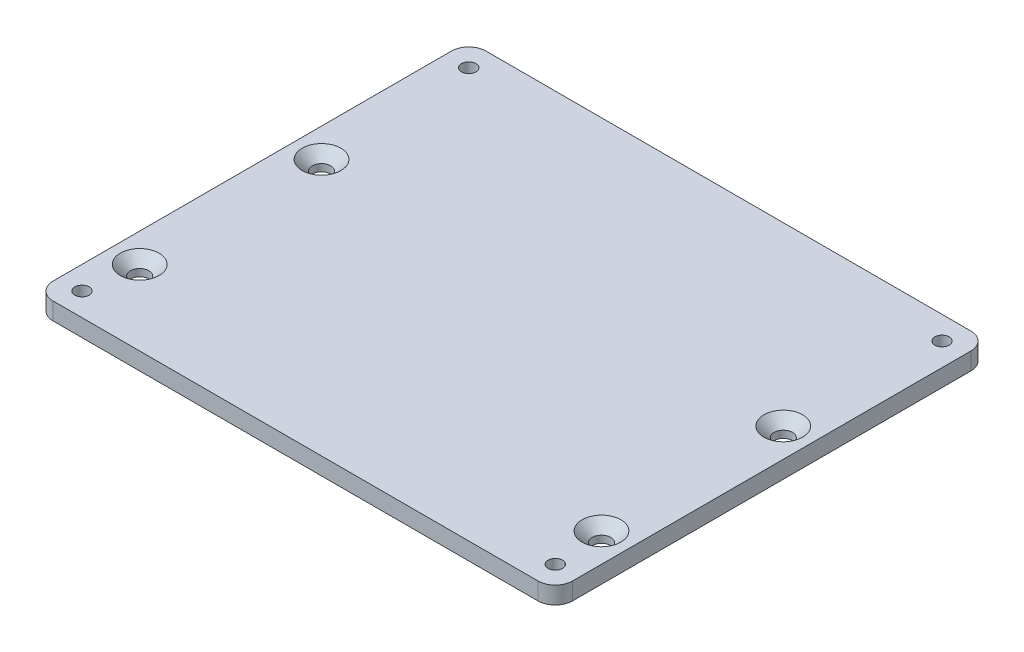
ISO-10303-21;
HEADER;
FILE_DESCRIPTION(('STEP AP214'),'2;1');
FILE_NAME('part.step','',(''),(''),'','','');
FILE_SCHEMA(('AUTOMOTIVE_DESIGN { 1 0 10303 214 1 1 1 1 }'));
ENDSEC;
DATA;
#1=APPLICATION_CONTEXT('core data for automotive mechanical design processes');
#2=APPLICATION_PROTOCOL_DEFINITION('international standard','automotive_design',2000,#1);
#3=PRODUCT_CONTEXT('',#1,'mechanical');
#4=PRODUCT('Part','Part','',(#3));
#5=PRODUCT_RELATED_PRODUCT_CATEGORY('part','',(#4));
#6=PRODUCT_DEFINITION_FORMATION('','',#4);
#7=PRODUCT_DEFINITION_CONTEXT('part definition',#1,'design');
#8=PRODUCT_DEFINITION('design','',#6,#7);
#9=PRODUCT_DEFINITION_SHAPE('','',#8);
#10=(LENGTH_UNIT() NAMED_UNIT(*) SI_UNIT(.MILLI.,.METRE.));
#11=(NAMED_UNIT(*) PLANE_ANGLE_UNIT() SI_UNIT($,.RADIAN.));
#12=(NAMED_UNIT(*) SI_UNIT($,.STERADIAN.) SOLID_ANGLE_UNIT());
#13=UNCERTAINTY_MEASURE_WITH_UNIT(LENGTH_MEASURE(1.E-05),#10,'distance_accuracy_value','');
#14=(GEOMETRIC_REPRESENTATION_CONTEXT(3) GLOBAL_UNCERTAINTY_ASSIGNED_CONTEXT((#13)) GLOBAL_UNIT_ASSIGNED_CONTEXT((#10,
#11,#12)) REPRESENTATION_CONTEXT('',''));
#15=CARTESIAN_POINT('',(0.,0.,0.));
#16=DIRECTION('',(0.,0.,1.));
#17=DIRECTION('',(1.,0.,0.));
#18=AXIS2_PLACEMENT_3D('',#15,#16,#17);
#19=CARTESIAN_POINT('',(-45.,3.,37.5));
#20=DIRECTION('',(1.,0.,0.));
#21=DIRECTION('',(0.,0.,-1.));
#22=AXIS2_PLACEMENT_3D('',#19,#20,#21);
#23=PLANE('',#22);
#24=DIRECTION('',(0.,0.,1.));
#25=VECTOR('',#24,1.);
#26=CARTESIAN_POINT('',(-45.,0.,37.5));
#27=LINE('',#26,#25);
#28=CARTESIAN_POINT('',(-45.,0.,-34.5));
#29=VERTEX_POINT('',#28);
#30=CARTESIAN_POINT('',(-45.,0.,34.5));
#31=VERTEX_POINT('',#30);
#32=EDGE_CURVE('E160',#29,#31,#27,.T.);
#33=ORIENTED_EDGE('',*,*,#32,.T.);
#34=DIRECTION('',(0.,-1.,0.));
#35=VECTOR('',#34,1.);
#36=CARTESIAN_POINT('',(-45.,3.,34.5));
#37=LINE('',#36,#35);
#38=CARTESIAN_POINT('',(-45.,3.,34.5));
#39=VERTEX_POINT('',#38);
#40=EDGE_CURVE('E11',#31,#39,#37,.F.);
#41=ORIENTED_EDGE('',*,*,#40,.T.);
#42=DIRECTION('',(0.,0.,1.));
#43=VECTOR('',#42,1.);
#44=CARTESIAN_POINT('',(-45.,3.,37.5));
#45=LINE('',#44,#43);
#46=CARTESIAN_POINT('',(-45.,3.,-34.5));
#47=VERTEX_POINT('',#46);
#48=EDGE_CURVE('E128',#47,#39,#45,.T.);
#49=ORIENTED_EDGE('',*,*,#48,.F.);
#50=DIRECTION('',(0.,-1.,0.));
#51=VECTOR('',#50,1.);
#52=CARTESIAN_POINT('',(-45.,3.,-34.5));
#53=LINE('',#52,#51);
#54=EDGE_CURVE('E44',#47,#29,#53,.T.);
#55=ORIENTED_EDGE('',*,*,#54,.T.);
#56=EDGE_LOOP('',(#33,#41,#49,#55));
#57=FACE_BOUND('',#56,.T.);
#58=ADVANCED_FACE('F36',(#57),#23,.F.);
#59=CARTESIAN_POINT('',(45.,3.,37.5));
#60=DIRECTION('',(0.,0.,-1.));
#61=DIRECTION('',(-1.,0.,0.));
#62=AXIS2_PLACEMENT_3D('',#59,#60,#61);
#63=PLANE('',#62);
#64=DIRECTION('',(1.,0.,0.));
#65=VECTOR('',#64,1.);
#66=CARTESIAN_POINT('',(45.,0.,37.5));
#67=LINE('',#66,#65);
#68=CARTESIAN_POINT('',(-42.,0.,37.5));
#69=VERTEX_POINT('',#68);
#70=CARTESIAN_POINT('',(42.,0.,37.5));
#71=VERTEX_POINT('',#70);
#72=EDGE_CURVE('E133',#69,#71,#67,.T.);
#73=ORIENTED_EDGE('',*,*,#72,.T.);
#74=DIRECTION('',(0.,-1.,0.));
#75=VECTOR('',#74,1.);
#76=CARTESIAN_POINT('',(42.,3.,37.5));
#77=LINE('',#76,#75);
#78=CARTESIAN_POINT('',(42.,3.,37.5));
#79=VERTEX_POINT('',#78);
#80=EDGE_CURVE('E51',#71,#79,#77,.F.);
#81=ORIENTED_EDGE('',*,*,#80,.T.);
#82=DIRECTION('',(1.,0.,0.));
#83=VECTOR('',#82,1.);
#84=CARTESIAN_POINT('',(45.,3.,37.5));
#85=LINE('',#84,#83);
#86=CARTESIAN_POINT('',(-42.,3.,37.5));
#87=VERTEX_POINT('',#86);
#88=EDGE_CURVE('E131',#87,#79,#85,.T.);
#89=ORIENTED_EDGE('',*,*,#88,.F.);
#90=DIRECTION('',(0.,-1.,0.));
#91=VECTOR('',#90,1.);
#92=CARTESIAN_POINT('',(-42.,3.,37.5));
#93=LINE('',#92,#91);
#94=EDGE_CURVE('E152',#87,#69,#93,.T.);
#95=ORIENTED_EDGE('',*,*,#94,.T.);
#96=EDGE_LOOP('',(#73,#81,#89,#95));
#97=FACE_BOUND('',#96,.T.);
#98=ADVANCED_FACE('F259',(#97),#63,.F.);
#99=CARTESIAN_POINT('',(45.,3.,37.5));
#100=DIRECTION('',(-1.,0.,0.));
#101=DIRECTION('',(0.,0.,1.));
#102=AXIS2_PLACEMENT_3D('',#99,#100,#101);
#103=PLANE('',#102);
#104=DIRECTION('',(0.,0.,-1.));
#105=VECTOR('',#104,1.);
#106=CARTESIAN_POINT('',(45.,0.,37.5));
#107=LINE('',#106,#105);
#108=CARTESIAN_POINT('',(45.,0.,34.5));
#109=VERTEX_POINT('',#108);
#110=CARTESIAN_POINT('',(45.,0.,-34.5));
#111=VERTEX_POINT('',#110);
#112=EDGE_CURVE('E129',#109,#111,#107,.T.);
#113=ORIENTED_EDGE('',*,*,#112,.T.);
#114=DIRECTION('',(0.,-1.,0.));
#115=VECTOR('',#114,1.);
#116=CARTESIAN_POINT('',(45.,3.,-34.5));
#117=LINE('',#116,#115);
#118=CARTESIAN_POINT('',(45.,3.,-34.5));
#119=VERTEX_POINT('',#118);
#120=EDGE_CURVE('E107',#111,#119,#117,.F.);
#121=ORIENTED_EDGE('',*,*,#120,.T.);
#122=DIRECTION('',(0.,0.,-1.));
#123=VECTOR('',#122,1.);
#124=CARTESIAN_POINT('',(45.,3.,37.5));
#125=LINE('',#124,#123);
#126=CARTESIAN_POINT('',(45.,3.,34.5));
#127=VERTEX_POINT('',#126);
#128=EDGE_CURVE('E172',#127,#119,#125,.T.);
#129=ORIENTED_EDGE('',*,*,#128,.F.);
#130=DIRECTION('',(0.,-1.,0.));
#131=VECTOR('',#130,1.);
#132=CARTESIAN_POINT('',(45.,3.,34.5));
#133=LINE('',#132,#131);
#134=EDGE_CURVE('E112',#127,#109,#133,.T.);
#135=ORIENTED_EDGE('',*,*,#134,.T.);
#136=EDGE_LOOP('',(#113,#121,#129,#135));
#137=FACE_BOUND('',#136,.T.);
#138=ADVANCED_FACE('F256',(#137),#103,.F.);
#139=CARTESIAN_POINT('',(45.,3.,-37.5));
#140=DIRECTION('',(0.,0.,1.));
#141=DIRECTION('',(1.,0.,0.));
#142=AXIS2_PLACEMENT_3D('',#139,#140,#141);
#143=PLANE('',#142);
#144=DIRECTION('',(-1.,0.,0.));
#145=VECTOR('',#144,1.);
#146=CARTESIAN_POINT('',(45.,3.,-37.5));
#147=LINE('',#146,#145);
#148=CARTESIAN_POINT('',(42.,3.,-37.5));
#149=VERTEX_POINT('',#148);
#150=CARTESIAN_POINT('',(-42.,3.,-37.5));
#151=VERTEX_POINT('',#150);
#152=EDGE_CURVE('E122',#149,#151,#147,.T.);
#153=ORIENTED_EDGE('',*,*,#152,.F.);
#154=DIRECTION('',(0.,-1.,0.));
#155=VECTOR('',#154,1.);
#156=CARTESIAN_POINT('',(42.,3.,-37.5));
#157=LINE('',#156,#155);
#158=CARTESIAN_POINT('',(42.,0.,-37.5));
#159=VERTEX_POINT('',#158);
#160=EDGE_CURVE('E106',#149,#159,#157,.T.);
#161=ORIENTED_EDGE('',*,*,#160,.T.);
#162=DIRECTION('',(-1.,0.,0.));
#163=VECTOR('',#162,1.);
#164=CARTESIAN_POINT('',(45.,0.,-37.5));
#165=LINE('',#164,#163);
#166=CARTESIAN_POINT('',(-42.,0.,-37.5));
#167=VERTEX_POINT('',#166);
#168=EDGE_CURVE('E119',#159,#167,#165,.T.);
#169=ORIENTED_EDGE('',*,*,#168,.T.);
#170=DIRECTION('',(0.,-1.,0.));
#171=VECTOR('',#170,1.);
#172=CARTESIAN_POINT('',(-42.,3.,-37.5));
#173=LINE('',#172,#171);
#174=EDGE_CURVE('E124',#167,#151,#173,.F.);
#175=ORIENTED_EDGE('',*,*,#174,.T.);
#176=EDGE_LOOP('',(#153,#161,#169,#175));
#177=FACE_BOUND('',#176,.T.);
#178=ADVANCED_FACE('F118',(#177),#143,.F.);
#179=CARTESIAN_POINT('',(0.,3.,0.));
#180=DIRECTION('',(0.,1.,0.));
#181=DIRECTION('',(0.,0.,1.));
#182=AXIS2_PLACEMENT_3D('',#179,#180,#181);
#183=PLANE('',#182);
#184=CARTESIAN_POINT('',(-40.,3.,-6.99999999999999));
#185=DIRECTION('',(0.,1.,0.));
#186=DIRECTION('',(0.,0.,1.));
#187=AXIS2_PLACEMENT_3D('',#184,#185,#186);
#188=CIRCLE('',#187,3.36);
#189=CARTESIAN_POINT('',(-40.,3.,-3.63999999999999));
#190=VERTEX_POINT('',#189);
#191=EDGE_CURVE('E229',#190,#190,#188,.T.);
#192=ORIENTED_EDGE('',*,*,#191,.F.);
#193=EDGE_LOOP('',(#192));
#194=FACE_BOUND('',#193,.T.);
#195=CARTESIAN_POINT('',(-40.,3.,24.5));
#196=DIRECTION('',(0.,1.,0.));
#197=DIRECTION('',(0.,0.,1.));
#198=AXIS2_PLACEMENT_3D('',#195,#196,#197);
#199=CIRCLE('',#198,3.36);
#200=CARTESIAN_POINT('',(-40.,3.,27.86));
#201=VERTEX_POINT('',#200);
#202=EDGE_CURVE('E220',#201,#201,#199,.T.);
#203=ORIENTED_EDGE('',*,*,#202,.F.);
#204=EDGE_LOOP('',(#203));
#205=FACE_BOUND('',#204,.T.);
#206=CARTESIAN_POINT('',(40.,3.,24.5));
#207=DIRECTION('',(0.,1.,0.));
#208=DIRECTION('',(0.,0.,1.));
#209=AXIS2_PLACEMENT_3D('',#206,#207,#208);
#210=CIRCLE('',#209,3.36);
#211=CARTESIAN_POINT('',(40.,3.,27.86));
#212=VERTEX_POINT('',#211);
#213=EDGE_CURVE('E211',#212,#212,#210,.T.);
#214=ORIENTED_EDGE('',*,*,#213,.F.);
#215=EDGE_LOOP('',(#214));
#216=FACE_BOUND('',#215,.T.);
#217=CARTESIAN_POINT('',(40.,3.,-7.));
#218=DIRECTION('',(0.,1.,0.));
#219=DIRECTION('',(0.,0.,1.));
#220=AXIS2_PLACEMENT_3D('',#217,#218,#219);
#221=CIRCLE('',#220,3.36);
#222=CARTESIAN_POINT('',(40.,3.,-3.64));
#223=VERTEX_POINT('',#222);
#224=EDGE_CURVE('E202',#223,#223,#221,.T.);
#225=ORIENTED_EDGE('',*,*,#224,.F.);
#226=EDGE_LOOP('',(#225));
#227=FACE_BOUND('',#226,.T.);
#228=CARTESIAN_POINT('',(-41.,3.,-33.5));
#229=DIRECTION('',(0.,1.,0.));
#230=DIRECTION('',(0.,0.,1.));
#231=AXIS2_PLACEMENT_3D('',#228,#229,#230);
#232=CIRCLE('',#231,1.25);
#233=CARTESIAN_POINT('',(-41.,3.,-32.25));
#234=VERTEX_POINT('',#233);
#235=EDGE_CURVE('E193',#234,#234,#232,.T.);
#236=ORIENTED_EDGE('',*,*,#235,.F.);
#237=EDGE_LOOP('',(#236));
#238=FACE_BOUND('',#237,.T.);
#239=CARTESIAN_POINT('',(-41.,3.,33.5));
#240=DIRECTION('',(0.,1.,0.));
#241=DIRECTION('',(0.,0.,1.));
#242=AXIS2_PLACEMENT_3D('',#239,#240,#241);
#243=CIRCLE('',#242,1.25);
#244=CARTESIAN_POINT('',(-41.,3.,34.75));
#245=VERTEX_POINT('',#244);
#246=EDGE_CURVE('E187',#245,#245,#243,.T.);
#247=ORIENTED_EDGE('',*,*,#246,.F.);
#248=EDGE_LOOP('',(#247));
#249=FACE_BOUND('',#248,.T.);
#250=CARTESIAN_POINT('',(41.,3.,33.5));
#251=DIRECTION('',(0.,1.,0.));
#252=DIRECTION('',(0.,0.,1.));
#253=AXIS2_PLACEMENT_3D('',#250,#251,#252);
#254=CIRCLE('',#253,1.25);
#255=CARTESIAN_POINT('',(41.,3.,34.75));
#256=VERTEX_POINT('',#255);
#257=EDGE_CURVE('E181',#256,#256,#254,.T.);
#258=ORIENTED_EDGE('',*,*,#257,.F.);
#259=EDGE_LOOP('',(#258));
#260=FACE_BOUND('',#259,.T.);
#261=CARTESIAN_POINT('',(41.,3.,-33.5));
#262=DIRECTION('',(0.,1.,0.));
#263=DIRECTION('',(0.,0.,1.));
#264=AXIS2_PLACEMENT_3D('',#261,#262,#263);
#265=CIRCLE('',#264,1.25);
#266=CARTESIAN_POINT('',(41.,3.,-32.25));
#267=VERTEX_POINT('',#266);
#268=EDGE_CURVE('E168',#267,#267,#265,.T.);
#269=ORIENTED_EDGE('',*,*,#268,.F.);
#270=EDGE_LOOP('',(#269));
#271=FACE_BOUND('',#270,.T.);
#272=ORIENTED_EDGE('',*,*,#128,.T.);
#273=CARTESIAN_POINT('',(42.,3.,-34.5));
#274=DIRECTION('',(0.,1.,0.));
#275=DIRECTION('',(0.,0.,1.));
#276=AXIS2_PLACEMENT_3D('',#273,#274,#275);
#277=CIRCLE('',#276,3.);
#278=EDGE_CURVE('E150',#119,#149,#277,.T.);
#279=ORIENTED_EDGE('',*,*,#278,.T.);
#280=ORIENTED_EDGE('',*,*,#152,.T.);
#281=CARTESIAN_POINT('',(-42.,3.,-34.5));
#282=DIRECTION('',(0.,1.,0.));
#283=DIRECTION('',(0.,0.,1.));
#284=AXIS2_PLACEMENT_3D('',#281,#282,#283);
#285=CIRCLE('',#284,3.);
#286=EDGE_CURVE('E145',#151,#47,#285,.T.);
#287=ORIENTED_EDGE('',*,*,#286,.T.);
#288=ORIENTED_EDGE('',*,*,#48,.T.);
#289=CARTESIAN_POINT('',(-42.,3.,34.5));
#290=DIRECTION('',(0.,1.,0.));
#291=DIRECTION('',(0.,0.,1.));
#292=AXIS2_PLACEMENT_3D('',#289,#290,#291);
#293=CIRCLE('',#292,3.);
#294=EDGE_CURVE('E58',#39,#87,#293,.T.);
#295=ORIENTED_EDGE('',*,*,#294,.T.);
#296=ORIENTED_EDGE('',*,*,#88,.T.);
#297=CARTESIAN_POINT('',(42.,3.,34.5));
#298=DIRECTION('',(0.,1.,0.));
#299=DIRECTION('',(0.,0.,1.));
#300=AXIS2_PLACEMENT_3D('',#297,#298,#299);
#301=CIRCLE('',#300,3.);
#302=EDGE_CURVE('E148',#79,#127,#301,.T.);
#303=ORIENTED_EDGE('',*,*,#302,.T.);
#304=EDGE_LOOP('',(#272,#279,#280,#287,#288,#295,#296,#303));
#305=FACE_BOUND('',#304,.T.);
#306=ADVANCED_FACE('F235',(#194,#205,#216,#227,#238,#249,#260,#271,#305),#183,.T.);
#307=CARTESIAN_POINT('',(0.,0.,0.));
#308=DIRECTION('',(0.,1.,0.));
#309=DIRECTION('',(0.,0.,1.));
#310=AXIS2_PLACEMENT_3D('',#307,#308,#309);
#311=PLANE('',#310);
#312=CARTESIAN_POINT('',(-40.,0.,-6.99999999999999));
#313=DIRECTION('',(0.,1.,0.));
#314=DIRECTION('',(0.,0.,1.));
#315=AXIS2_PLACEMENT_3D('',#312,#313,#314);
#316=CIRCLE('',#315,1.6);
#317=CARTESIAN_POINT('',(-40.,0.,-5.39999999999999));
#318=VERTEX_POINT('',#317);
#319=EDGE_CURVE('E223',#318,#318,#316,.T.);
#320=ORIENTED_EDGE('',*,*,#319,.T.);
#321=EDGE_LOOP('',(#320));
#322=FACE_BOUND('',#321,.T.);
#323=CARTESIAN_POINT('',(-40.,0.,24.5));
#324=DIRECTION('',(0.,1.,0.));
#325=DIRECTION('',(0.,0.,1.));
#326=AXIS2_PLACEMENT_3D('',#323,#324,#325);
#327=CIRCLE('',#326,1.6);
#328=CARTESIAN_POINT('',(-40.,0.,26.1));
#329=VERTEX_POINT('',#328);
#330=EDGE_CURVE('E214',#329,#329,#327,.T.);
#331=ORIENTED_EDGE('',*,*,#330,.T.);
#332=EDGE_LOOP('',(#331));
#333=FACE_BOUND('',#332,.T.);
#334=CARTESIAN_POINT('',(40.,0.,24.5));
#335=DIRECTION('',(0.,1.,0.));
#336=DIRECTION('',(0.,0.,1.));
#337=AXIS2_PLACEMENT_3D('',#334,#335,#336);
#338=CIRCLE('',#337,1.6);
#339=CARTESIAN_POINT('',(40.,0.,26.1));
#340=VERTEX_POINT('',#339);
#341=EDGE_CURVE('E205',#340,#340,#338,.T.);
#342=ORIENTED_EDGE('',*,*,#341,.T.);
#343=EDGE_LOOP('',(#342));
#344=FACE_BOUND('',#343,.T.);
#345=CARTESIAN_POINT('',(40.,0.,-7.));
#346=DIRECTION('',(0.,1.,0.));
#347=DIRECTION('',(0.,0.,1.));
#348=AXIS2_PLACEMENT_3D('',#345,#346,#347);
#349=CIRCLE('',#348,1.6);
#350=CARTESIAN_POINT('',(40.,0.,-5.4));
#351=VERTEX_POINT('',#350);
#352=EDGE_CURVE('E196',#351,#351,#349,.T.);
#353=ORIENTED_EDGE('',*,*,#352,.T.);
#354=EDGE_LOOP('',(#353));
#355=FACE_BOUND('',#354,.T.);
#356=CARTESIAN_POINT('',(-41.,0.,-33.5));
#357=DIRECTION('',(0.,1.,0.));
#358=DIRECTION('',(0.,0.,1.));
#359=AXIS2_PLACEMENT_3D('',#356,#357,#358);
#360=CIRCLE('',#359,1.25);
#361=CARTESIAN_POINT('',(-41.,0.,-32.25));
#362=VERTEX_POINT('',#361);
#363=EDGE_CURVE('E190',#362,#362,#360,.T.);
#364=ORIENTED_EDGE('',*,*,#363,.T.);
#365=EDGE_LOOP('',(#364));
#366=FACE_BOUND('',#365,.T.);
#367=CARTESIAN_POINT('',(-41.,0.,33.5));
#368=DIRECTION('',(0.,1.,0.));
#369=DIRECTION('',(0.,0.,1.));
#370=AXIS2_PLACEMENT_3D('',#367,#368,#369);
#371=CIRCLE('',#370,1.25);
#372=CARTESIAN_POINT('',(-41.,0.,34.75));
#373=VERTEX_POINT('',#372);
#374=EDGE_CURVE('E184',#373,#373,#371,.T.);
#375=ORIENTED_EDGE('',*,*,#374,.T.);
#376=EDGE_LOOP('',(#375));
#377=FACE_BOUND('',#376,.T.);
#378=CARTESIAN_POINT('',(41.,0.,33.5));
#379=DIRECTION('',(0.,1.,0.));
#380=DIRECTION('',(0.,0.,1.));
#381=AXIS2_PLACEMENT_3D('',#378,#379,#380);
#382=CIRCLE('',#381,1.25);
#383=CARTESIAN_POINT('',(41.,0.,34.75));
#384=VERTEX_POINT('',#383);
#385=EDGE_CURVE('E178',#384,#384,#382,.T.);
#386=ORIENTED_EDGE('',*,*,#385,.T.);
#387=EDGE_LOOP('',(#386));
#388=FACE_BOUND('',#387,.T.);
#389=CARTESIAN_POINT('',(41.,0.,-33.5));
#390=DIRECTION('',(0.,1.,0.));
#391=DIRECTION('',(0.,0.,1.));
#392=AXIS2_PLACEMENT_3D('',#389,#390,#391);
#393=CIRCLE('',#392,1.25);
#394=CARTESIAN_POINT('',(41.,0.,-32.25));
#395=VERTEX_POINT('',#394);
#396=EDGE_CURVE('E165',#395,#395,#393,.T.);
#397=ORIENTED_EDGE('',*,*,#396,.T.);
#398=EDGE_LOOP('',(#397));
#399=FACE_BOUND('',#398,.T.);
#400=ORIENTED_EDGE('',*,*,#168,.F.);
#401=CARTESIAN_POINT('',(42.,0.,-34.5));
#402=DIRECTION('',(0.,1.,0.));
#403=DIRECTION('',(0.,0.,1.));
#404=AXIS2_PLACEMENT_3D('',#401,#402,#403);
#405=CIRCLE('',#404,3.);
#406=EDGE_CURVE('E102',#159,#111,#405,.F.);
#407=ORIENTED_EDGE('',*,*,#406,.T.);
#408=ORIENTED_EDGE('',*,*,#112,.F.);
#409=CARTESIAN_POINT('',(42.,0.,34.5));
#410=DIRECTION('',(0.,1.,0.));
#411=DIRECTION('',(0.,0.,1.));
#412=AXIS2_PLACEMENT_3D('',#409,#410,#411);
#413=CIRCLE('',#412,3.);
#414=EDGE_CURVE('E113',#109,#71,#413,.F.);
#415=ORIENTED_EDGE('',*,*,#414,.T.);
#416=ORIENTED_EDGE('',*,*,#72,.F.);
#417=CARTESIAN_POINT('',(-42.,0.,34.5));
#418=DIRECTION('',(0.,1.,0.));
#419=DIRECTION('',(0.,0.,1.));
#420=AXIS2_PLACEMENT_3D('',#417,#418,#419);
#421=CIRCLE('',#420,3.);
#422=EDGE_CURVE('E139',#69,#31,#421,.F.);
#423=ORIENTED_EDGE('',*,*,#422,.T.);
#424=ORIENTED_EDGE('',*,*,#32,.F.);
#425=CARTESIAN_POINT('',(-42.,0.,-34.5));
#426=DIRECTION('',(0.,1.,0.));
#427=DIRECTION('',(0.,0.,1.));
#428=AXIS2_PLACEMENT_3D('',#425,#426,#427);
#429=CIRCLE('',#428,3.);
#430=EDGE_CURVE('E123',#29,#167,#429,.F.);
#431=ORIENTED_EDGE('',*,*,#430,.T.);
#432=EDGE_LOOP('',(#400,#407,#408,#415,#416,#423,#424,#431));
#433=FACE_BOUND('',#432,.T.);
#434=ADVANCED_FACE('F126',(#322,#333,#344,#355,#366,#377,#388,#399,#433),#311,.F.);
#435=CARTESIAN_POINT('',(41.,3.,-33.5));
#436=DIRECTION('',(0.,1.,0.));
#437=DIRECTION('',(0.,0.,1.));
#438=AXIS2_PLACEMENT_3D('',#435,#436,#437);
#439=CYLINDRICAL_SURFACE('',#438,1.25);
#440=ORIENTED_EDGE('',*,*,#396,.F.);
#441=EDGE_LOOP('',(#440));
#442=FACE_BOUND('',#441,.T.);
#443=ORIENTED_EDGE('',*,*,#268,.T.);
#444=EDGE_LOOP('',(#443));
#445=FACE_BOUND('',#444,.T.);
#446=ADVANCED_FACE('F318',(#442,#445),#439,.F.);
#447=CARTESIAN_POINT('',(41.,3.,33.5));
#448=DIRECTION('',(0.,1.,0.));
#449=DIRECTION('',(0.,0.,1.));
#450=AXIS2_PLACEMENT_3D('',#447,#448,#449);
#451=CYLINDRICAL_SURFACE('',#450,1.25);
#452=ORIENTED_EDGE('',*,*,#385,.F.);
#453=EDGE_LOOP('',(#452));
#454=FACE_BOUND('',#453,.T.);
#455=ORIENTED_EDGE('',*,*,#257,.T.);
#456=EDGE_LOOP('',(#455));
#457=FACE_BOUND('',#456,.T.);
#458=ADVANCED_FACE('F440',(#454,#457),#451,.F.);
#459=CARTESIAN_POINT('',(-41.,3.,33.5));
#460=DIRECTION('',(0.,1.,0.));
#461=DIRECTION('',(0.,0.,1.));
#462=AXIS2_PLACEMENT_3D('',#459,#460,#461);
#463=CYLINDRICAL_SURFACE('',#462,1.25);
#464=ORIENTED_EDGE('',*,*,#374,.F.);
#465=EDGE_LOOP('',(#464));
#466=FACE_BOUND('',#465,.T.);
#467=ORIENTED_EDGE('',*,*,#246,.T.);
#468=EDGE_LOOP('',(#467));
#469=FACE_BOUND('',#468,.T.);
#470=ADVANCED_FACE('F430',(#466,#469),#463,.F.);
#471=CARTESIAN_POINT('',(-41.,3.,-33.5));
#472=DIRECTION('',(0.,1.,0.));
#473=DIRECTION('',(0.,0.,1.));
#474=AXIS2_PLACEMENT_3D('',#471,#472,#473);
#475=CYLINDRICAL_SURFACE('',#474,1.25);
#476=ORIENTED_EDGE('',*,*,#363,.F.);
#477=EDGE_LOOP('',(#476));
#478=FACE_BOUND('',#477,.T.);
#479=ORIENTED_EDGE('',*,*,#235,.T.);
#480=EDGE_LOOP('',(#479));
#481=FACE_BOUND('',#480,.T.);
#482=ADVANCED_FACE('F282',(#478,#481),#475,.F.);
#483=CARTESIAN_POINT('',(42.,3.,-34.5));
#484=DIRECTION('',(0.,-1.,0.));
#485=DIRECTION('',(0.,0.,-1.));
#486=AXIS2_PLACEMENT_3D('',#483,#484,#485);
#487=CYLINDRICAL_SURFACE('',#486,3.);
#488=ORIENTED_EDGE('',*,*,#278,.F.);
#489=ORIENTED_EDGE('',*,*,#120,.F.);
#490=ORIENTED_EDGE('',*,*,#406,.F.);
#491=ORIENTED_EDGE('',*,*,#160,.F.);
#492=EDGE_LOOP('',(#488,#489,#490,#491));
#493=FACE_BOUND('',#492,.T.);
#494=ADVANCED_FACE('F105',(#493),#487,.T.);
#495=CARTESIAN_POINT('',(42.,3.,34.5));
#496=DIRECTION('',(0.,-1.,0.));
#497=DIRECTION('',(0.,0.,-1.));
#498=AXIS2_PLACEMENT_3D('',#495,#496,#497);
#499=CYLINDRICAL_SURFACE('',#498,3.);
#500=ORIENTED_EDGE('',*,*,#302,.F.);
#501=ORIENTED_EDGE('',*,*,#80,.F.);
#502=ORIENTED_EDGE('',*,*,#414,.F.);
#503=ORIENTED_EDGE('',*,*,#134,.F.);
#504=EDGE_LOOP('',(#500,#501,#502,#503));
#505=FACE_BOUND('',#504,.T.);
#506=ADVANCED_FACE('F258',(#505),#499,.T.);
#507=CARTESIAN_POINT('',(-42.,3.,34.5));
#508=DIRECTION('',(0.,-1.,0.));
#509=DIRECTION('',(0.,0.,-1.));
#510=AXIS2_PLACEMENT_3D('',#507,#508,#509);
#511=CYLINDRICAL_SURFACE('',#510,3.);
#512=ORIENTED_EDGE('',*,*,#294,.F.);
#513=ORIENTED_EDGE('',*,*,#40,.F.);
#514=ORIENTED_EDGE('',*,*,#422,.F.);
#515=ORIENTED_EDGE('',*,*,#94,.F.);
#516=EDGE_LOOP('',(#512,#513,#514,#515));
#517=FACE_BOUND('',#516,.T.);
#518=ADVANCED_FACE('F262',(#517),#511,.T.);
#519=CARTESIAN_POINT('',(-42.,3.,-34.5));
#520=DIRECTION('',(0.,-1.,0.));
#521=DIRECTION('',(0.,0.,-1.));
#522=AXIS2_PLACEMENT_3D('',#519,#520,#521);
#523=CYLINDRICAL_SURFACE('',#522,3.);
#524=ORIENTED_EDGE('',*,*,#286,.F.);
#525=ORIENTED_EDGE('',*,*,#174,.F.);
#526=ORIENTED_EDGE('',*,*,#430,.F.);
#527=ORIENTED_EDGE('',*,*,#54,.F.);
#528=EDGE_LOOP('',(#524,#525,#526,#527));
#529=FACE_BOUND('',#528,.T.);
#530=ADVANCED_FACE('F38',(#529),#523,.T.);
#531=CARTESIAN_POINT('',(40.,3.,-7.));
#532=DIRECTION('',(0.,1.,0.));
#533=DIRECTION('',(0.,0.,1.));
#534=AXIS2_PLACEMENT_3D('',#531,#532,#533);
#535=CYLINDRICAL_SURFACE('',#534,1.6);
#536=ORIENTED_EDGE('',*,*,#352,.F.);
#537=EDGE_LOOP('',(#536));
#538=FACE_BOUND('',#537,.T.);
#539=CARTESIAN_POINT('',(40.,1.24,-7.));
#540=DIRECTION('',(0.,1.,0.));
#541=DIRECTION('',(0.,0.,1.));
#542=AXIS2_PLACEMENT_3D('',#539,#540,#541);
#543=CIRCLE('',#542,1.6);
#544=CARTESIAN_POINT('',(40.,1.24,-5.4));
#545=VERTEX_POINT('',#544);
#546=EDGE_CURVE('E199',#545,#545,#543,.T.);
#547=ORIENTED_EDGE('',*,*,#546,.T.);
#548=EDGE_LOOP('',(#547));
#549=FACE_BOUND('',#548,.T.);
#550=ADVANCED_FACE('F264',(#538,#549),#535,.F.);
#551=CARTESIAN_POINT('',(40.,3.,-7.));
#552=DIRECTION('',(0.,1.,0.));
#553=DIRECTION('',(0.,0.,1.));
#554=AXIS2_PLACEMENT_3D('',#551,#552,#553);
#555=CONICAL_SURFACE('',#554,3.36,0.78539816339745);
#556=ORIENTED_EDGE('',*,*,#546,.F.);
#557=EDGE_LOOP('',(#556));
#558=FACE_BOUND('',#557,.T.);
#559=ORIENTED_EDGE('',*,*,#224,.T.);
#560=EDGE_LOOP('',(#559));
#561=FACE_BOUND('',#560,.T.);
#562=ADVANCED_FACE('F269',(#558,#561),#555,.F.);
#563=CARTESIAN_POINT('',(40.,3.,24.5));
#564=DIRECTION('',(0.,1.,0.));
#565=DIRECTION('',(0.,0.,1.));
#566=AXIS2_PLACEMENT_3D('',#563,#564,#565);
#567=CYLINDRICAL_SURFACE('',#566,1.6);
#568=ORIENTED_EDGE('',*,*,#341,.F.);
#569=EDGE_LOOP('',(#568));
#570=FACE_BOUND('',#569,.T.);
#571=CARTESIAN_POINT('',(40.,1.24,24.5));
#572=DIRECTION('',(0.,1.,0.));
#573=DIRECTION('',(0.,0.,1.));
#574=AXIS2_PLACEMENT_3D('',#571,#572,#573);
#575=CIRCLE('',#574,1.6);
#576=CARTESIAN_POINT('',(40.,1.24,26.1));
#577=VERTEX_POINT('',#576);
#578=EDGE_CURVE('E208',#577,#577,#575,.T.);
#579=ORIENTED_EDGE('',*,*,#578,.T.);
#580=EDGE_LOOP('',(#579));
#581=FACE_BOUND('',#580,.T.);
#582=ADVANCED_FACE('F337',(#570,#581),#567,.F.);
#583=CARTESIAN_POINT('',(40.,3.,24.5));
#584=DIRECTION('',(0.,1.,0.));
#585=DIRECTION('',(0.,0.,1.));
#586=AXIS2_PLACEMENT_3D('',#583,#584,#585);
#587=CONICAL_SURFACE('',#586,3.36,0.78539816339745);
#588=ORIENTED_EDGE('',*,*,#578,.F.);
#589=EDGE_LOOP('',(#588));
#590=FACE_BOUND('',#589,.T.);
#591=ORIENTED_EDGE('',*,*,#213,.T.);
#592=EDGE_LOOP('',(#591));
#593=FACE_BOUND('',#592,.T.);
#594=ADVANCED_FACE('F348',(#590,#593),#587,.F.);
#595=CARTESIAN_POINT('',(-40.,3.,24.5));
#596=DIRECTION('',(0.,1.,0.));
#597=DIRECTION('',(0.,0.,1.));
#598=AXIS2_PLACEMENT_3D('',#595,#596,#597);
#599=CYLINDRICAL_SURFACE('',#598,1.6);
#600=ORIENTED_EDGE('',*,*,#330,.F.);
#601=EDGE_LOOP('',(#600));
#602=FACE_BOUND('',#601,.T.);
#603=CARTESIAN_POINT('',(-40.,1.24,24.5));
#604=DIRECTION('',(0.,1.,0.));
#605=DIRECTION('',(0.,0.,1.));
#606=AXIS2_PLACEMENT_3D('',#603,#604,#605);
#607=CIRCLE('',#606,1.6);
#608=CARTESIAN_POINT('',(-40.,1.24,26.1));
#609=VERTEX_POINT('',#608);
#610=EDGE_CURVE('E217',#609,#609,#607,.T.);
#611=ORIENTED_EDGE('',*,*,#610,.T.);
#612=EDGE_LOOP('',(#611));
#613=FACE_BOUND('',#612,.T.);
#614=ADVANCED_FACE('F359',(#602,#613),#599,.F.);
#615=CARTESIAN_POINT('',(-40.,3.,24.5));
#616=DIRECTION('',(0.,1.,0.));
#617=DIRECTION('',(0.,0.,1.));
#618=AXIS2_PLACEMENT_3D('',#615,#616,#617);
#619=CONICAL_SURFACE('',#618,3.36,0.78539816339745);
#620=ORIENTED_EDGE('',*,*,#610,.F.);
#621=EDGE_LOOP('',(#620));
#622=FACE_BOUND('',#621,.T.);
#623=ORIENTED_EDGE('',*,*,#202,.T.);
#624=EDGE_LOOP('',(#623));
#625=FACE_BOUND('',#624,.T.);
#626=ADVANCED_FACE('F370',(#622,#625),#619,.F.);
#627=CARTESIAN_POINT('',(-40.,3.,-6.99999999999999));
#628=DIRECTION('',(0.,1.,0.));
#629=DIRECTION('',(0.,0.,1.));
#630=AXIS2_PLACEMENT_3D('',#627,#628,#629);
#631=CYLINDRICAL_SURFACE('',#630,1.6);
#632=ORIENTED_EDGE('',*,*,#319,.F.);
#633=EDGE_LOOP('',(#632));
#634=FACE_BOUND('',#633,.T.);
#635=CARTESIAN_POINT('',(-40.,1.24,-6.99999999999999));
#636=DIRECTION('',(0.,1.,0.));
#637=DIRECTION('',(0.,0.,1.));
#638=AXIS2_PLACEMENT_3D('',#635,#636,#637);
#639=CIRCLE('',#638,1.6);
#640=CARTESIAN_POINT('',(-40.,1.24,-5.39999999999999));
#641=VERTEX_POINT('',#640);
#642=EDGE_CURVE('E226',#641,#641,#639,.T.);
#643=ORIENTED_EDGE('',*,*,#642,.T.);
#644=EDGE_LOOP('',(#643));
#645=FACE_BOUND('',#644,.T.);
#646=ADVANCED_FACE('F381',(#634,#645),#631,.F.);
#647=CARTESIAN_POINT('',(-40.,3.,-6.99999999999999));
#648=DIRECTION('',(0.,1.,0.));
#649=DIRECTION('',(0.,0.,1.));
#650=AXIS2_PLACEMENT_3D('',#647,#648,#649);
#651=CONICAL_SURFACE('',#650,3.36,0.78539816339745);
#652=ORIENTED_EDGE('',*,*,#642,.F.);
#653=EDGE_LOOP('',(#652));
#654=FACE_BOUND('',#653,.T.);
#655=ORIENTED_EDGE('',*,*,#191,.T.);
#656=EDGE_LOOP('',(#655));
#657=FACE_BOUND('',#656,.T.);
#658=ADVANCED_FACE('F233',(#654,#657),#651,.F.);
#659=CLOSED_SHELL('',(#58,#98,#138,#178,#306,#434,#446,#458,#470,#482,#494,#506,#518,#530,#550,
#562,#582,#594,#614,#626,#646,#658));
#660=MANIFOLD_SOLID_BREP('B2',#659);
#661=ADVANCED_BREP_SHAPE_REPRESENTATION('',(#18,#660),#14);
#662=SHAPE_DEFINITION_REPRESENTATION(#9,#661);
ENDSEC;
END-ISO-10303-21;
